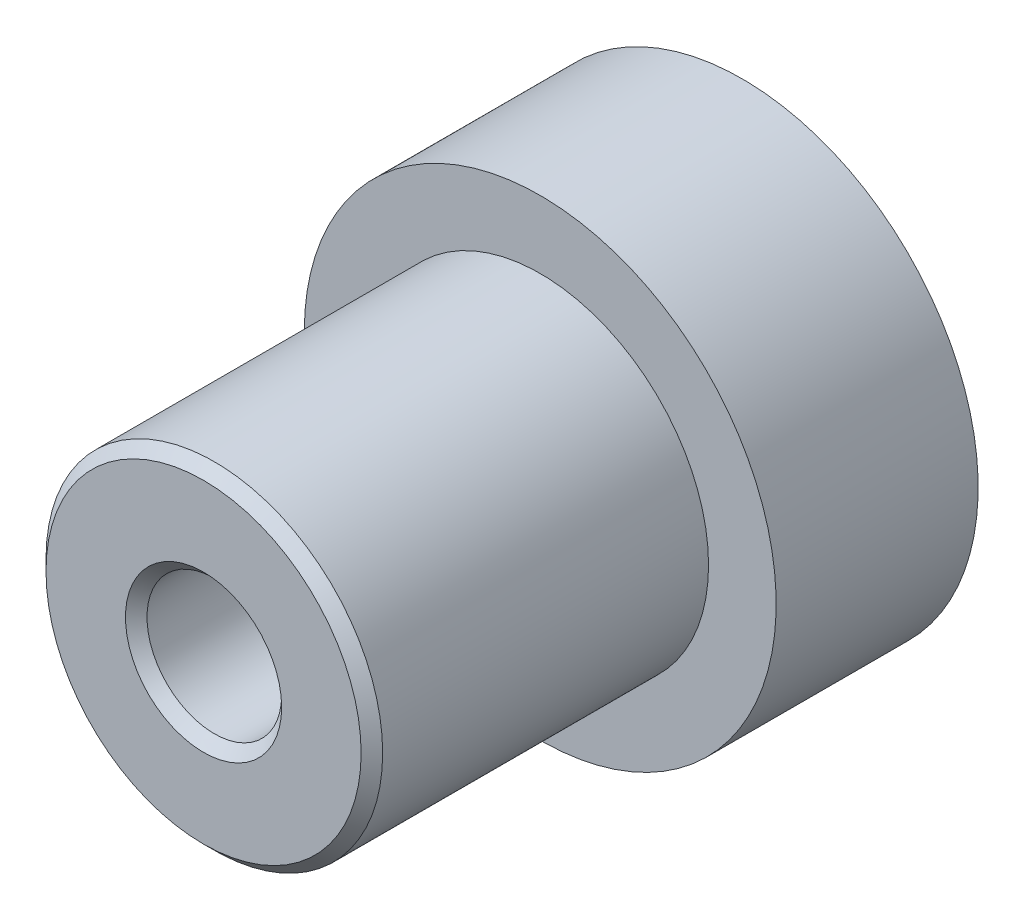
ISO-10303-21;
HEADER;
FILE_DESCRIPTION(('STEP AP214'),'2;1');
FILE_NAME('part.step','',(''),(''),'','','');
FILE_SCHEMA(('AUTOMOTIVE_DESIGN { 1 0 10303 214 1 1 1 1 }'));
ENDSEC;
DATA;
#1=APPLICATION_CONTEXT('core data for automotive mechanical design processes');
#2=APPLICATION_PROTOCOL_DEFINITION('international standard','automotive_design',2000,#1);
#3=PRODUCT_CONTEXT('',#1,'mechanical');
#4=PRODUCT('Part','Part','',(#3));
#5=PRODUCT_RELATED_PRODUCT_CATEGORY('part','',(#4));
#6=PRODUCT_DEFINITION_FORMATION('','',#4);
#7=PRODUCT_DEFINITION_CONTEXT('part definition',#1,'design');
#8=PRODUCT_DEFINITION('design','',#6,#7);
#9=PRODUCT_DEFINITION_SHAPE('','',#8);
#10=(LENGTH_UNIT() NAMED_UNIT(*) SI_UNIT(.MILLI.,.METRE.));
#11=(NAMED_UNIT(*) PLANE_ANGLE_UNIT() SI_UNIT($,.RADIAN.));
#12=(NAMED_UNIT(*) SI_UNIT($,.STERADIAN.) SOLID_ANGLE_UNIT());
#13=UNCERTAINTY_MEASURE_WITH_UNIT(LENGTH_MEASURE(1.E-05),#10,'distance_accuracy_value','');
#14=(GEOMETRIC_REPRESENTATION_CONTEXT(3) GLOBAL_UNCERTAINTY_ASSIGNED_CONTEXT((#13)) GLOBAL_UNIT_ASSIGNED_CONTEXT((#10,
#11,#12)) REPRESENTATION_CONTEXT('',''));
#15=CARTESIAN_POINT('',(0.,0.,0.));
#16=DIRECTION('',(0.,0.,1.));
#17=DIRECTION('',(1.,0.,0.));
#18=AXIS2_PLACEMENT_3D('',#15,#16,#17);
#19=CARTESIAN_POINT('',(0.,0.,4.7625));
#20=DIRECTION('',(0.,0.,1.));
#21=DIRECTION('',(1.,0.,0.));
#22=AXIS2_PLACEMENT_3D('',#19,#20,#21);
#23=PLANE('',#22);
#24=CARTESIAN_POINT('',(0.,0.,4.7625));
#25=DIRECTION('',(0.,0.,1.));
#26=DIRECTION('',(1.,0.,0.));
#27=AXIS2_PLACEMENT_3D('',#24,#25,#26);
#28=CIRCLE('',#27,5.5626);
#29=CARTESIAN_POINT('',(-5.5626,0.,4.7625));
#30=VERTEX_POINT('',#29);
#31=EDGE_CURVE('E57',#30,#30,#28,.T.);
#32=ORIENTED_EDGE('',*,*,#31,.T.);
#33=EDGE_LOOP('',(#32));
#34=FACE_BOUND('',#33,.T.);
#35=CARTESIAN_POINT('',(0.,0.,4.7625));
#36=DIRECTION('',(0.,0.,1.));
#37=DIRECTION('',(1.,0.,0.));
#38=AXIS2_PLACEMENT_3D('',#35,#36,#37);
#39=CIRCLE('',#38,3.96875);
#40=CARTESIAN_POINT('',(3.96875,0.,4.7625));
#41=VERTEX_POINT('',#40);
#42=EDGE_CURVE('E61',#41,#41,#39,.T.);
#43=ORIENTED_EDGE('',*,*,#42,.F.);
#44=EDGE_LOOP('',(#43));
#45=FACE_BOUND('',#44,.T.);
#46=ADVANCED_FACE('F31',(#34,#45),#23,.T.);
#47=CARTESIAN_POINT('',(0.,0.,4.7625));
#48=DIRECTION('',(0.,0.,-1.));
#49=DIRECTION('',(-1.,0.,0.));
#50=AXIS2_PLACEMENT_3D('',#47,#48,#49);
#51=CYLINDRICAL_SURFACE('',#50,5.5626);
#52=CARTESIAN_POINT('',(0.,0.,0.));
#53=DIRECTION('',(0.,0.,1.));
#54=DIRECTION('',(1.,0.,0.));
#55=AXIS2_PLACEMENT_3D('',#52,#53,#54);
#56=CIRCLE('',#55,5.5626);
#57=CARTESIAN_POINT('',(-5.5626,0.,0.));
#58=VERTEX_POINT('',#57);
#59=EDGE_CURVE('E58',#58,#58,#56,.T.);
#60=CARTESIAN_POINT('',(-5.5626,0.,4.7625));
#61=CARTESIAN_POINT('',(-5.5626,0.,4.712890625));
#62=CARTESIAN_POINT('',(-5.5626,0.,4.66328125));
#63=CARTESIAN_POINT('',(-5.5626,0.,4.5640625));
#64=CARTESIAN_POINT('',(-5.5626,0.,4.514453125));
#65=CARTESIAN_POINT('',(-5.5626,0.,4.415234375));
#66=CARTESIAN_POINT('',(-5.5626,0.,4.365625));
#67=CARTESIAN_POINT('',(-5.5626,0.,4.26640625));
#68=CARTESIAN_POINT('',(-5.5626,0.,4.216796875));
#69=CARTESIAN_POINT('',(-5.5626,0.,4.117578125));
#70=CARTESIAN_POINT('',(-5.5626,0.,4.06796875));
#71=CARTESIAN_POINT('',(-5.5626,0.,3.96875));
#72=CARTESIAN_POINT('',(-5.5626,0.,3.919140625));
#73=CARTESIAN_POINT('',(-5.5626,0.,3.819921875));
#74=CARTESIAN_POINT('',(-5.5626,0.,3.7703125));
#75=CARTESIAN_POINT('',(-5.5626,0.,3.67109375));
#76=CARTESIAN_POINT('',(-5.5626,0.,3.621484375));
#77=CARTESIAN_POINT('',(-5.5626,0.,3.522265625));
#78=CARTESIAN_POINT('',(-5.5626,0.,3.47265625));
#79=CARTESIAN_POINT('',(-5.5626,0.,3.3734375));
#80=CARTESIAN_POINT('',(-5.5626,0.,3.323828125));
#81=CARTESIAN_POINT('',(-5.5626,0.,3.224609375));
#82=CARTESIAN_POINT('',(-5.5626,0.,3.175));
#83=CARTESIAN_POINT('',(-5.5626,0.,3.07578125));
#84=CARTESIAN_POINT('',(-5.5626,0.,3.026171875));
#85=CARTESIAN_POINT('',(-5.5626,0.,2.926953125));
#86=CARTESIAN_POINT('',(-5.5626,0.,2.87734375));
#87=CARTESIAN_POINT('',(-5.5626,0.,2.778125));
#88=CARTESIAN_POINT('',(-5.5626,0.,2.728515625));
#89=CARTESIAN_POINT('',(-5.5626,0.,2.629296875));
#90=CARTESIAN_POINT('',(-5.5626,0.,2.5796875));
#91=CARTESIAN_POINT('',(-5.5626,0.,2.48046875));
#92=CARTESIAN_POINT('',(-5.5626,0.,2.430859375));
#93=CARTESIAN_POINT('',(-5.5626,0.,2.331640625));
#94=CARTESIAN_POINT('',(-5.5626,0.,2.28203125));
#95=CARTESIAN_POINT('',(-5.5626,0.,2.1828125));
#96=CARTESIAN_POINT('',(-5.5626,0.,2.133203125));
#97=CARTESIAN_POINT('',(-5.5626,0.,2.033984375));
#98=CARTESIAN_POINT('',(-5.5626,0.,1.984375));
#99=CARTESIAN_POINT('',(-5.5626,0.,1.88515625));
#100=CARTESIAN_POINT('',(-5.5626,0.,1.835546875));
#101=CARTESIAN_POINT('',(-5.5626,0.,1.736328125));
#102=CARTESIAN_POINT('',(-5.5626,0.,1.68671875));
#103=CARTESIAN_POINT('',(-5.5626,0.,1.5875));
#104=CARTESIAN_POINT('',(-5.5626,0.,1.537890625));
#105=CARTESIAN_POINT('',(-5.5626,0.,1.438671875));
#106=CARTESIAN_POINT('',(-5.5626,0.,1.3890625));
#107=CARTESIAN_POINT('',(-5.5626,0.,1.28984375));
#108=CARTESIAN_POINT('',(-5.5626,0.,1.240234375));
#109=CARTESIAN_POINT('',(-5.5626,0.,1.141015625));
#110=CARTESIAN_POINT('',(-5.5626,0.,1.09140625));
#111=CARTESIAN_POINT('',(-5.5626,0.,0.992187499999999));
#112=CARTESIAN_POINT('',(-5.5626,0.,0.942578124999999));
#113=CARTESIAN_POINT('',(-5.5626,0.,0.843359375));
#114=CARTESIAN_POINT('',(-5.5626,0.,0.79375));
#115=CARTESIAN_POINT('',(-5.5626,0.,0.69453125));
#116=CARTESIAN_POINT('',(-5.5626,0.,0.644921875));
#117=CARTESIAN_POINT('',(-5.5626,0.,0.545703125));
#118=CARTESIAN_POINT('',(-5.5626,0.,0.49609375));
#119=CARTESIAN_POINT('',(-5.5626,0.,0.396875));
#120=CARTESIAN_POINT('',(-5.5626,0.,0.347265625));
#121=CARTESIAN_POINT('',(-5.5626,0.,0.248046875));
#122=CARTESIAN_POINT('',(-5.5626,0.,0.1984375));
#123=CARTESIAN_POINT('',(-5.5626,0.,0.09921875));
#124=CARTESIAN_POINT('',(-5.5626,0.,0.049609375));
#125=CARTESIAN_POINT('',(-5.5626,0.,0.));
#126=B_SPLINE_CURVE_WITH_KNOTS('',3,(#60,#61,#62,#63,#64,#65,#66,#67,#68,#69,#70,#71,#72,#73,
#74,#75,#76,#77,#78,#79,#80,#81,#82,#83,#84,#85,#86,#87,#88,#89,#90,#91,#92,#93,#94,#95,#96,#97,
#98,#99,#100,#101,#102,#103,#104,#105,#106,#107,#108,#109,#110,#111,#112,#113,#114,#115,#116,
#117,#118,#119,#120,#121,#122,#123,#124,#125),.UNSPECIFIED.,.F.,.F.,(4,2,2,2,2,2,2,2,2,2,2,2,2,
2,2,2,2,2,2,2,2,2,2,2,2,2,2,2,2,2,2,2,4),(0.,0.148828125,0.29765625,0.446484375,0.5953125,
0.744140625,0.892968750000001,1.041796875,1.190625,1.339453125,1.48828125,1.637109375,1.7859375,
1.934765625,2.08359375,2.232421875,2.38125,2.530078125,2.67890625,2.827734375,2.9765625,
3.125390625,3.27421875,3.423046875,3.571875,3.720703125,3.86953125,4.018359375,4.1671875,
4.316015625,4.46484375,4.613671875,4.7625),.UNSPECIFIED.);
#127=EDGE_CURVE('BSEAM70',#30,#58,#126,.T.);
#128=ORIENTED_EDGE('',*,*,#31,.F.);
#129=ORIENTED_EDGE('',*,*,#59,.T.);
#130=ORIENTED_EDGE('',*,*,#127,.T.);
#131=ORIENTED_EDGE('',*,*,#127,.F.);
#132=EDGE_LOOP('',(#128,#130,#129,#131));
#133=FACE_BOUND('',#132,.T.);
#134=ADVANCED_FACE('F70',(#133),#51,.T.);
#135=CARTESIAN_POINT('',(0.,0.,0.));
#136=DIRECTION('',(0.,0.,1.));
#137=DIRECTION('',(1.,0.,0.));
#138=AXIS2_PLACEMENT_3D('',#135,#136,#137);
#139=PLANE('',#138);
#140=CARTESIAN_POINT('',(0.,0.,0.));
#141=DIRECTION('',(0.,0.,1.));
#142=DIRECTION('',(1.,0.,0.));
#143=AXIS2_PLACEMENT_3D('',#140,#141,#142);
#144=CIRCLE('',#143,1.8415);
#145=CARTESIAN_POINT('',(1.8415,0.,0.));
#146=VERTEX_POINT('',#145);
#147=EDGE_CURVE('E46',#146,#146,#144,.T.);
#148=ORIENTED_EDGE('',*,*,#147,.T.);
#149=EDGE_LOOP('',(#148));
#150=FACE_BOUND('',#149,.T.);
#151=ORIENTED_EDGE('',*,*,#59,.F.);
#152=EDGE_LOOP('',(#151));
#153=FACE_BOUND('',#152,.T.);
#154=ADVANCED_FACE('F76',(#150,#153),#139,.F.);
#155=CARTESIAN_POINT('',(0.,0.,12.7));
#156=DIRECTION('',(0.,0.,-1.));
#157=DIRECTION('',(-1.,0.,0.));
#158=AXIS2_PLACEMENT_3D('',#155,#156,#157);
#159=CYLINDRICAL_SURFACE('',#158,3.96875);
#160=CARTESIAN_POINT('',(0.,0.,12.446));
#161=DIRECTION('',(0.,0.,1.));
#162=DIRECTION('',(1.,0.,0.));
#163=AXIS2_PLACEMENT_3D('',#160,#161,#162);
#164=CIRCLE('',#163,3.96875);
#165=CARTESIAN_POINT('',(3.96875,0.,12.446));
#166=VERTEX_POINT('',#165);
#167=EDGE_CURVE('E10',#166,#166,#164,.F.);
#168=ORIENTED_EDGE('',*,*,#167,.T.);
#169=EDGE_LOOP('',(#168));
#170=FACE_BOUND('',#169,.T.);
#171=ORIENTED_EDGE('',*,*,#42,.T.);
#172=EDGE_LOOP('',(#171));
#173=FACE_BOUND('',#172,.T.);
#174=ADVANCED_FACE('F67',(#170,#173),#159,.T.);
#175=CARTESIAN_POINT('',(0.,0.,12.7));
#176=DIRECTION('',(0.,0.,1.));
#177=DIRECTION('',(1.,0.,0.));
#178=AXIS2_PLACEMENT_3D('',#175,#176,#177);
#179=PLANE('',#178);
#180=CARTESIAN_POINT('',(0.,0.,12.7));
#181=DIRECTION('',(0.,0.,1.));
#182=DIRECTION('',(1.,0.,0.));
#183=AXIS2_PLACEMENT_3D('',#180,#181,#182);
#184=CIRCLE('',#183,1.8415);
#185=CARTESIAN_POINT('',(1.8415,0.,12.7));
#186=VERTEX_POINT('',#185);
#187=EDGE_CURVE('E38',#186,#186,#184,.F.);
#188=ORIENTED_EDGE('',*,*,#187,.T.);
#189=EDGE_LOOP('',(#188));
#190=FACE_BOUND('',#189,.T.);
#191=CARTESIAN_POINT('',(0.,0.,12.7));
#192=DIRECTION('',(0.,0.,1.));
#193=DIRECTION('',(1.,0.,0.));
#194=AXIS2_PLACEMENT_3D('',#191,#192,#193);
#195=CIRCLE('',#194,3.71475);
#196=CARTESIAN_POINT('',(3.71475,0.,12.7));
#197=VERTEX_POINT('',#196);
#198=EDGE_CURVE('E42',#197,#197,#195,.T.);
#199=ORIENTED_EDGE('',*,*,#198,.T.);
#200=EDGE_LOOP('',(#199));
#201=FACE_BOUND('',#200,.T.);
#202=ADVANCED_FACE('F100',(#190,#201),#179,.T.);
#203=CARTESIAN_POINT('',(0.,0.,12.7));
#204=DIRECTION('',(0.,0.,-1.));
#205=DIRECTION('',(-1.,0.,0.));
#206=AXIS2_PLACEMENT_3D('',#203,#204,#205);
#207=CYLINDRICAL_SURFACE('',#206,1.5875);
#208=CARTESIAN_POINT('',(0.,0.,0.253999999999997));
#209=DIRECTION('',(0.,0.,1.));
#210=DIRECTION('',(1.,0.,0.));
#211=AXIS2_PLACEMENT_3D('',#208,#209,#210);
#212=CIRCLE('',#211,1.5875);
#213=CARTESIAN_POINT('',(1.5875,0.,0.253999999999997));
#214=VERTEX_POINT('',#213);
#215=EDGE_CURVE('E51',#214,#214,#212,.F.);
#216=ORIENTED_EDGE('',*,*,#215,.T.);
#217=EDGE_LOOP('',(#216));
#218=FACE_BOUND('',#217,.T.);
#219=CARTESIAN_POINT('',(0.,0.,12.446));
#220=DIRECTION('',(0.,0.,1.));
#221=DIRECTION('',(1.,0.,0.));
#222=AXIS2_PLACEMENT_3D('',#219,#220,#221);
#223=CIRCLE('',#222,1.5875);
#224=CARTESIAN_POINT('',(1.5875,0.,12.446));
#225=VERTEX_POINT('',#224);
#226=EDGE_CURVE('E54',#225,#225,#223,.T.);
#227=ORIENTED_EDGE('',*,*,#226,.T.);
#228=EDGE_LOOP('',(#227));
#229=FACE_BOUND('',#228,.T.);
#230=ADVANCED_FACE('F88',(#218,#229),#207,.F.);
#231=CARTESIAN_POINT('',(0.,0.,0.253999999999997));
#232=DIRECTION('',(0.,0.,-1.));
#233=DIRECTION('',(-1.,0.,0.));
#234=AXIS2_PLACEMENT_3D('',#231,#232,#233);
#235=CONICAL_SURFACE('',#234,1.5875,0.785398163397453);
#236=ORIENTED_EDGE('',*,*,#147,.F.);
#237=EDGE_LOOP('',(#236));
#238=FACE_BOUND('',#237,.T.);
#239=ORIENTED_EDGE('',*,*,#215,.F.);
#240=EDGE_LOOP('',(#239));
#241=FACE_BOUND('',#240,.T.);
#242=ADVANCED_FACE('F85',(#238,#241),#235,.F.);
#243=CARTESIAN_POINT('',(0.,0.,12.7));
#244=DIRECTION('',(0.,0.,1.));
#245=DIRECTION('',(1.,0.,0.));
#246=AXIS2_PLACEMENT_3D('',#243,#244,#245);
#247=CONICAL_SURFACE('',#246,1.8415,0.785398163397446);
#248=ORIENTED_EDGE('',*,*,#226,.F.);
#249=EDGE_LOOP('',(#248));
#250=FACE_BOUND('',#249,.T.);
#251=ORIENTED_EDGE('',*,*,#187,.F.);
#252=EDGE_LOOP('',(#251));
#253=FACE_BOUND('',#252,.T.);
#254=ADVANCED_FACE('F87',(#250,#253),#247,.F.);
#255=CARTESIAN_POINT('',(0.,0.,12.7));
#256=DIRECTION('',(0.,0.,-1.));
#257=DIRECTION('',(-1.,0.,0.));
#258=AXIS2_PLACEMENT_3D('',#255,#256,#257);
#259=CONICAL_SURFACE('',#258,3.71475,0.785398163397445);
#260=ORIENTED_EDGE('',*,*,#167,.F.);
#261=EDGE_LOOP('',(#260));
#262=FACE_BOUND('',#261,.T.);
#263=ORIENTED_EDGE('',*,*,#198,.F.);
#264=EDGE_LOOP('',(#263));
#265=FACE_BOUND('',#264,.T.);
#266=ADVANCED_FACE('F33',(#262,#265),#259,.T.);
#267=CLOSED_SHELL('',(#46,#134,#154,#174,#202,#230,#242,#254,#266));
#268=MANIFOLD_SOLID_BREP('B2',#267);
#269=ADVANCED_BREP_SHAPE_REPRESENTATION('',(#18,#268),#14);
#270=SHAPE_DEFINITION_REPRESENTATION(#9,#269);
ENDSEC;
END-ISO-10303-21;
